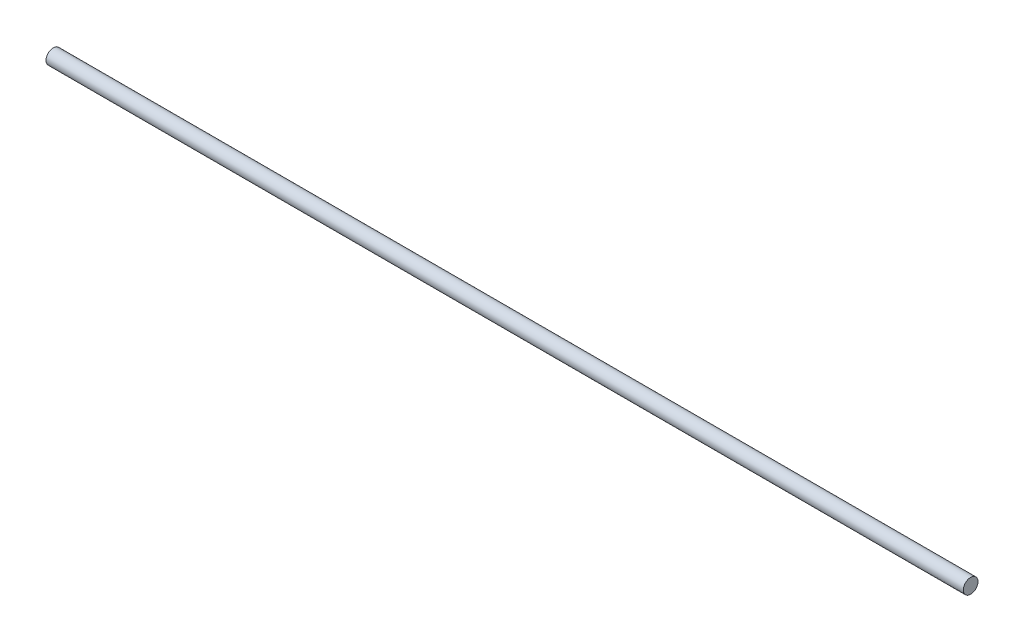
ISO-10303-21;
HEADER;
FILE_DESCRIPTION(('STEP AP214'),'2;1');
FILE_NAME('part.step','',(''),(''),'','','');
FILE_SCHEMA(('AUTOMOTIVE_DESIGN { 1 0 10303 214 1 1 1 1 }'));
ENDSEC;
DATA;
#1=APPLICATION_CONTEXT('core data for automotive mechanical design processes');
#2=APPLICATION_PROTOCOL_DEFINITION('international standard','automotive_design',2000,#1);
#3=PRODUCT_CONTEXT('',#1,'mechanical');
#4=PRODUCT('Part','Part','',(#3));
#5=PRODUCT_RELATED_PRODUCT_CATEGORY('part','',(#4));
#6=PRODUCT_DEFINITION_FORMATION('','',#4);
#7=PRODUCT_DEFINITION_CONTEXT('part definition',#1,'design');
#8=PRODUCT_DEFINITION('design','',#6,#7);
#9=PRODUCT_DEFINITION_SHAPE('','',#8);
#10=(LENGTH_UNIT() NAMED_UNIT(*) SI_UNIT(.MILLI.,.METRE.));
#11=(NAMED_UNIT(*) PLANE_ANGLE_UNIT() SI_UNIT($,.RADIAN.));
#12=(NAMED_UNIT(*) SI_UNIT($,.STERADIAN.) SOLID_ANGLE_UNIT());
#13=UNCERTAINTY_MEASURE_WITH_UNIT(LENGTH_MEASURE(1.E-05),#10,'distance_accuracy_value','');
#14=(GEOMETRIC_REPRESENTATION_CONTEXT(3) GLOBAL_UNCERTAINTY_ASSIGNED_CONTEXT((#13)) GLOBAL_UNIT_ASSIGNED_CONTEXT((#10,
#11,#12)) REPRESENTATION_CONTEXT('',''));
#15=CARTESIAN_POINT('',(0.,0.,0.));
#16=DIRECTION('',(0.,0.,1.));
#17=DIRECTION('',(1.,0.,0.));
#18=AXIS2_PLACEMENT_3D('',#15,#16,#17);
#19=CARTESIAN_POINT('',(750.,0.,0.));
#20=DIRECTION('',(-1.,0.,0.));
#21=DIRECTION('',(0.,0.,1.));
#22=AXIS2_PLACEMENT_3D('',#19,#20,#21);
#23=CYLINDRICAL_SURFACE('',#22,6.);
#24=CARTESIAN_POINT('',(750.,0.,0.));
#25=DIRECTION('',(1.,0.,0.));
#26=DIRECTION('',(0.,0.,-1.));
#27=AXIS2_PLACEMENT_3D('',#24,#25,#26);
#28=CIRCLE('',#27,6.);
#29=CARTESIAN_POINT('',(750.,0.,-6.));
#30=VERTEX_POINT('',#29);
#31=EDGE_CURVE('E12',#30,#30,#28,.T.);
#32=ORIENTED_EDGE('',*,*,#31,.F.);
#33=EDGE_LOOP('',(#32));
#34=FACE_BOUND('',#33,.T.);
#35=CARTESIAN_POINT('',(0.,0.,0.));
#36=DIRECTION('',(1.,0.,0.));
#37=DIRECTION('',(0.,0.,-1.));
#38=AXIS2_PLACEMENT_3D('',#35,#36,#37);
#39=CIRCLE('',#38,6.);
#40=CARTESIAN_POINT('',(0.,0.,-6.));
#41=VERTEX_POINT('',#40);
#42=EDGE_CURVE('E50',#41,#41,#39,.T.);
#43=ORIENTED_EDGE('',*,*,#42,.T.);
#44=EDGE_LOOP('',(#43));
#45=FACE_BOUND('',#44,.T.);
#46=ADVANCED_FACE('F47',(#34,#45),#23,.T.);
#47=CARTESIAN_POINT('',(750.,0.,0.));
#48=DIRECTION('',(1.,0.,0.));
#49=DIRECTION('',(0.,0.,-1.));
#50=AXIS2_PLACEMENT_3D('',#47,#48,#49);
#51=PLANE('',#50);
#52=ORIENTED_EDGE('',*,*,#31,.T.);
#53=EDGE_LOOP('',(#52));
#54=FACE_BOUND('',#53,.T.);
#55=ADVANCED_FACE('F62',(#54),#51,.T.);
#56=CARTESIAN_POINT('',(0.,0.,0.));
#57=DIRECTION('',(1.,0.,0.));
#58=DIRECTION('',(0.,0.,-1.));
#59=AXIS2_PLACEMENT_3D('',#56,#57,#58);
#60=PLANE('',#59);
#61=ORIENTED_EDGE('',*,*,#42,.F.);
#62=EDGE_LOOP('',(#61));
#63=FACE_BOUND('',#62,.T.);
#64=ADVANCED_FACE('F60',(#63),#60,.F.);
#65=CLOSED_SHELL('',(#46,#55,#64));
#66=MANIFOLD_SOLID_BREP('B2',#65);
#67=ADVANCED_BREP_SHAPE_REPRESENTATION('',(#18,#66),#14);
#68=SHAPE_DEFINITION_REPRESENTATION(#9,#67);
ENDSEC;
END-ISO-10303-21;
